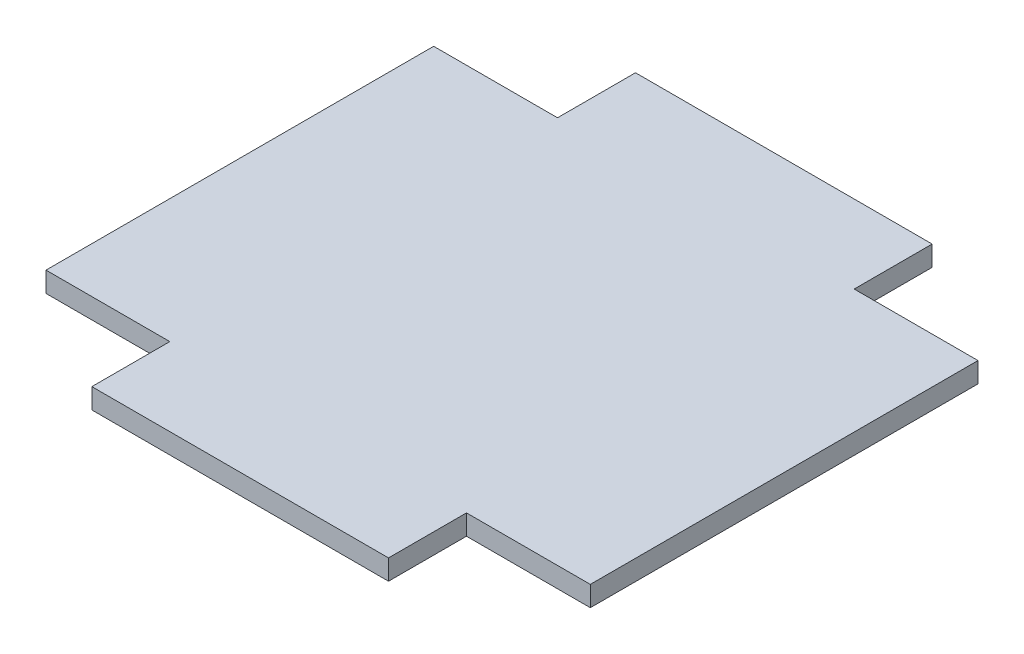
ISO-10303-21;
HEADER;
FILE_DESCRIPTION(('STEP AP214'),'2;1');
FILE_NAME('part.step','',(''),(''),'','','');
FILE_SCHEMA(('AUTOMOTIVE_DESIGN { 1 0 10303 214 1 1 1 1 }'));
ENDSEC;
DATA;
#1=APPLICATION_CONTEXT('core data for automotive mechanical design processes');
#2=APPLICATION_PROTOCOL_DEFINITION('international standard','automotive_design',2000,#1);
#3=PRODUCT_CONTEXT('',#1,'mechanical');
#4=PRODUCT('Part','Part','',(#3));
#5=PRODUCT_RELATED_PRODUCT_CATEGORY('part','',(#4));
#6=PRODUCT_DEFINITION_FORMATION('','',#4);
#7=PRODUCT_DEFINITION_CONTEXT('part definition',#1,'design');
#8=PRODUCT_DEFINITION('design','',#6,#7);
#9=PRODUCT_DEFINITION_SHAPE('','',#8);
#10=(LENGTH_UNIT() NAMED_UNIT(*) SI_UNIT(.MILLI.,.METRE.));
#11=(NAMED_UNIT(*) PLANE_ANGLE_UNIT() SI_UNIT($,.RADIAN.));
#12=(NAMED_UNIT(*) SI_UNIT($,.STERADIAN.) SOLID_ANGLE_UNIT());
#13=UNCERTAINTY_MEASURE_WITH_UNIT(LENGTH_MEASURE(1.E-05),#10,'distance_accuracy_value','');
#14=(GEOMETRIC_REPRESENTATION_CONTEXT(3) GLOBAL_UNCERTAINTY_ASSIGNED_CONTEXT((#13)) GLOBAL_UNIT_ASSIGNED_CONTEXT((#10,
#11,#12)) REPRESENTATION_CONTEXT('',''));
#15=CARTESIAN_POINT('',(0.,0.,0.));
#16=DIRECTION('',(0.,0.,1.));
#17=DIRECTION('',(1.,0.,0.));
#18=AXIS2_PLACEMENT_3D('',#15,#16,#17);
#19=CARTESIAN_POINT('',(7.40524174118847,3.,-22.9007241262733));
#20=DIRECTION('',(1.,0.,0.));
#21=DIRECTION('',(0.,0.,-1.));
#22=AXIS2_PLACEMENT_3D('',#19,#20,#21);
#23=PLANE('',#22);
#24=DIRECTION('',(0.,0.,1.));
#25=VECTOR('',#24,1.);
#26=CARTESIAN_POINT('',(7.40524174118847,0.,-22.9007241262733));
#27=LINE('',#26,#25);
#28=CARTESIAN_POINT('',(7.40524174118848,0.,-34.4657241262733));
#29=VERTEX_POINT('',#28);
#30=CARTESIAN_POINT('',(7.40524174118847,0.,-22.9007241262733));
#31=VERTEX_POINT('',#30);
#32=EDGE_CURVE('E153',#29,#31,#27,.T.);
#33=ORIENTED_EDGE('',*,*,#32,.T.);
#34=DIRECTION('',(0.,-1.,0.));
#35=VECTOR('',#34,1.);
#36=CARTESIAN_POINT('',(7.40524174118847,3.,-22.9007241262733));
#37=LINE('',#36,#35);
#38=CARTESIAN_POINT('',(7.40524174118847,3.,-22.9007241262733));
#39=VERTEX_POINT('',#38);
#40=EDGE_CURVE('E11',#39,#31,#37,.T.);
#41=ORIENTED_EDGE('',*,*,#40,.F.);
#42=DIRECTION('',(0.,0.,1.));
#43=VECTOR('',#42,1.);
#44=CARTESIAN_POINT('',(7.40524174118847,3.,-22.9007241262733));
#45=LINE('',#44,#43);
#46=CARTESIAN_POINT('',(7.40524174118848,3.,-34.4657241262733));
#47=VERTEX_POINT('',#46);
#48=EDGE_CURVE('E175',#47,#39,#45,.T.);
#49=ORIENTED_EDGE('',*,*,#48,.F.);
#50=DIRECTION('',(0.,-1.,0.));
#51=VECTOR('',#50,1.);
#52=CARTESIAN_POINT('',(7.40524174118848,3.,-34.4657241262733));
#53=LINE('',#52,#51);
#54=EDGE_CURVE('E149',#47,#29,#53,.T.);
#55=ORIENTED_EDGE('',*,*,#54,.T.);
#56=EDGE_LOOP('',(#33,#41,#49,#55));
#57=FACE_BOUND('',#56,.T.);
#58=ADVANCED_FACE('F33',(#57),#23,.F.);
#59=CARTESIAN_POINT('',(-10.9597582588115,3.,-22.9007241262733));
#60=DIRECTION('',(0.,0.,1.));
#61=DIRECTION('',(1.,0.,0.));
#62=AXIS2_PLACEMENT_3D('',#59,#60,#61);
#63=PLANE('',#62);
#64=DIRECTION('',(-1.,0.,0.));
#65=VECTOR('',#64,1.);
#66=CARTESIAN_POINT('',(-10.9597582588115,0.,-22.9007241262733));
#67=LINE('',#66,#65);
#68=CARTESIAN_POINT('',(-10.9597582588115,0.,-22.9007241262733));
#69=VERTEX_POINT('',#68);
#70=EDGE_CURVE('E156',#31,#69,#67,.T.);
#71=ORIENTED_EDGE('',*,*,#70,.T.);
#72=DIRECTION('',(0.,-1.,0.));
#73=VECTOR('',#72,1.);
#74=CARTESIAN_POINT('',(-10.9597582588115,3.,-22.9007241262733));
#75=LINE('',#74,#73);
#76=CARTESIAN_POINT('',(-10.9597582588115,3.,-22.9007241262733));
#77=VERTEX_POINT('',#76);
#78=EDGE_CURVE('E41',#77,#69,#75,.T.);
#79=ORIENTED_EDGE('',*,*,#78,.F.);
#80=DIRECTION('',(-1.,0.,0.));
#81=VECTOR('',#80,1.);
#82=CARTESIAN_POINT('',(-10.9597582588115,3.,-22.9007241262733));
#83=LINE('',#82,#81);
#84=EDGE_CURVE('E104',#39,#77,#83,.T.);
#85=ORIENTED_EDGE('',*,*,#84,.F.);
#86=ORIENTED_EDGE('',*,*,#40,.T.);
#87=EDGE_LOOP('',(#71,#79,#85,#86));
#88=FACE_BOUND('',#87,.T.);
#89=ADVANCED_FACE('F253',(#88),#63,.F.);
#90=CARTESIAN_POINT('',(-10.9597582588115,3.,34.5992758737267));
#91=DIRECTION('',(1.,0.,0.));
#92=DIRECTION('',(0.,0.,-1.));
#93=AXIS2_PLACEMENT_3D('',#90,#91,#92);
#94=PLANE('',#93);
#95=DIRECTION('',(0.,0.,1.));
#96=VECTOR('',#95,1.);
#97=CARTESIAN_POINT('',(-10.9597582588115,0.,34.5992758737267));
#98=LINE('',#97,#96);
#99=CARTESIAN_POINT('',(-10.9597582588115,0.,34.5992758737267));
#100=VERTEX_POINT('',#99);
#101=EDGE_CURVE('E158',#69,#100,#98,.T.);
#102=ORIENTED_EDGE('',*,*,#101,.T.);
#103=DIRECTION('',(0.,-1.,0.));
#104=VECTOR('',#103,1.);
#105=CARTESIAN_POINT('',(-10.9597582588115,3.,34.5992758737267));
#106=LINE('',#105,#104);
#107=CARTESIAN_POINT('',(-10.9597582588115,3.,34.5992758737267));
#108=VERTEX_POINT('',#107);
#109=EDGE_CURVE('E194',#108,#100,#106,.T.);
#110=ORIENTED_EDGE('',*,*,#109,.F.);
#111=DIRECTION('',(0.,0.,1.));
#112=VECTOR('',#111,1.);
#113=CARTESIAN_POINT('',(-10.9597582588115,3.,34.5992758737267));
#114=LINE('',#113,#112);
#115=EDGE_CURVE('E202',#77,#108,#114,.T.);
#116=ORIENTED_EDGE('',*,*,#115,.F.);
#117=ORIENTED_EDGE('',*,*,#78,.T.);
#118=EDGE_LOOP('',(#102,#110,#116,#117));
#119=FACE_BOUND('',#118,.T.);
#120=ADVANCED_FACE('F200',(#119),#94,.F.);
#121=CARTESIAN_POINT('',(7.40524174118849,3.,34.5992758737267));
#122=DIRECTION('',(0.,0.,-1.));
#123=DIRECTION('',(-1.,0.,0.));
#124=AXIS2_PLACEMENT_3D('',#121,#122,#123);
#125=PLANE('',#124);
#126=DIRECTION('',(1.,0.,0.));
#127=VECTOR('',#126,1.);
#128=CARTESIAN_POINT('',(7.40524174118849,0.,34.5992758737267));
#129=LINE('',#128,#127);
#130=CARTESIAN_POINT('',(7.40524174118849,0.,34.5992758737267));
#131=VERTEX_POINT('',#130);
#132=EDGE_CURVE('E160',#100,#131,#129,.T.);
#133=ORIENTED_EDGE('',*,*,#132,.T.);
#134=DIRECTION('',(0.,-1.,0.));
#135=VECTOR('',#134,1.);
#136=CARTESIAN_POINT('',(7.40524174118849,3.,34.5992758737267));
#137=LINE('',#136,#135);
#138=CARTESIAN_POINT('',(7.40524174118849,3.,34.5992758737267));
#139=VERTEX_POINT('',#138);
#140=EDGE_CURVE('E191',#139,#131,#137,.T.);
#141=ORIENTED_EDGE('',*,*,#140,.F.);
#142=DIRECTION('',(1.,0.,0.));
#143=VECTOR('',#142,1.);
#144=CARTESIAN_POINT('',(7.40524174118849,3.,34.5992758737267));
#145=LINE('',#144,#143);
#146=EDGE_CURVE('E220',#108,#139,#145,.T.);
#147=ORIENTED_EDGE('',*,*,#146,.F.);
#148=ORIENTED_EDGE('',*,*,#109,.T.);
#149=EDGE_LOOP('',(#133,#141,#147,#148));
#150=FACE_BOUND('',#149,.T.);
#151=ADVANCED_FACE('F211',(#150),#125,.F.);
#152=CARTESIAN_POINT('',(7.40524174118849,3.,34.5992758737267));
#153=DIRECTION('',(1.,0.,0.));
#154=DIRECTION('',(0.,0.,-1.));
#155=AXIS2_PLACEMENT_3D('',#152,#153,#154);
#156=PLANE('',#155);
#157=DIRECTION('',(0.,0.,1.));
#158=VECTOR('',#157,1.);
#159=CARTESIAN_POINT('',(7.40524174118849,0.,34.5992758737267));
#160=LINE('',#159,#158);
#161=CARTESIAN_POINT('',(7.40524174118849,0.,46.1642758737267));
#162=VERTEX_POINT('',#161);
#163=EDGE_CURVE('E162',#131,#162,#160,.T.);
#164=ORIENTED_EDGE('',*,*,#163,.T.);
#165=DIRECTION('',(0.,-1.,0.));
#166=VECTOR('',#165,1.);
#167=CARTESIAN_POINT('',(7.40524174118849,3.,46.1642758737267));
#168=LINE('',#167,#166);
#169=CARTESIAN_POINT('',(7.40524174118849,3.,46.1642758737267));
#170=VERTEX_POINT('',#169);
#171=EDGE_CURVE('E188',#170,#162,#168,.T.);
#172=ORIENTED_EDGE('',*,*,#171,.F.);
#173=DIRECTION('',(0.,0.,1.));
#174=VECTOR('',#173,1.);
#175=CARTESIAN_POINT('',(7.40524174118849,3.,34.5992758737267));
#176=LINE('',#175,#174);
#177=EDGE_CURVE('E217',#139,#170,#176,.T.);
#178=ORIENTED_EDGE('',*,*,#177,.F.);
#179=ORIENTED_EDGE('',*,*,#140,.T.);
#180=EDGE_LOOP('',(#164,#172,#178,#179));
#181=FACE_BOUND('',#180,.T.);
#182=ADVANCED_FACE('F215',(#181),#156,.F.);
#183=CARTESIAN_POINT('',(7.40524174118849,3.,46.1642758737267));
#184=DIRECTION('',(0.,0.,-1.));
#185=DIRECTION('',(-1.,0.,0.));
#186=AXIS2_PLACEMENT_3D('',#183,#184,#185);
#187=PLANE('',#186);
#188=DIRECTION('',(1.,0.,0.));
#189=VECTOR('',#188,1.);
#190=CARTESIAN_POINT('',(7.40524174118849,0.,46.1642758737267));
#191=LINE('',#190,#189);
#192=CARTESIAN_POINT('',(51.4052417411885,0.,46.1642758737267));
#193=VERTEX_POINT('',#192);
#194=EDGE_CURVE('E164',#162,#193,#191,.T.);
#195=ORIENTED_EDGE('',*,*,#194,.T.);
#196=DIRECTION('',(0.,-1.,0.));
#197=VECTOR('',#196,1.);
#198=CARTESIAN_POINT('',(51.4052417411885,3.,46.1642758737267));
#199=LINE('',#198,#197);
#200=CARTESIAN_POINT('',(51.4052417411885,3.,46.1642758737267));
#201=VERTEX_POINT('',#200);
#202=EDGE_CURVE('E185',#201,#193,#199,.T.);
#203=ORIENTED_EDGE('',*,*,#202,.F.);
#204=DIRECTION('',(1.,0.,0.));
#205=VECTOR('',#204,1.);
#206=CARTESIAN_POINT('',(7.40524174118849,3.,46.1642758737267));
#207=LINE('',#206,#205);
#208=EDGE_CURVE('E219',#170,#201,#207,.T.);
#209=ORIENTED_EDGE('',*,*,#208,.F.);
#210=ORIENTED_EDGE('',*,*,#171,.T.);
#211=EDGE_LOOP('',(#195,#203,#209,#210));
#212=FACE_BOUND('',#211,.T.);
#213=ADVANCED_FACE('F266',(#212),#187,.F.);
#214=CARTESIAN_POINT('',(51.4052417411885,3.,46.1642758737267));
#215=DIRECTION('',(-1.,0.,0.));
#216=DIRECTION('',(0.,0.,1.));
#217=AXIS2_PLACEMENT_3D('',#214,#215,#216);
#218=PLANE('',#217);
#219=DIRECTION('',(0.,0.,-1.));
#220=VECTOR('',#219,1.);
#221=CARTESIAN_POINT('',(51.4052417411885,0.,46.1642758737267));
#222=LINE('',#221,#220);
#223=CARTESIAN_POINT('',(51.4052417411885,0.,34.5992758737267));
#224=VERTEX_POINT('',#223);
#225=EDGE_CURVE('E166',#193,#224,#222,.T.);
#226=ORIENTED_EDGE('',*,*,#225,.T.);
#227=DIRECTION('',(0.,-1.,0.));
#228=VECTOR('',#227,1.);
#229=CARTESIAN_POINT('',(51.4052417411885,3.,34.5992758737267));
#230=LINE('',#229,#228);
#231=CARTESIAN_POINT('',(51.4052417411885,3.,34.5992758737267));
#232=VERTEX_POINT('',#231);
#233=EDGE_CURVE('E182',#232,#224,#230,.T.);
#234=ORIENTED_EDGE('',*,*,#233,.F.);
#235=DIRECTION('',(0.,0.,-1.));
#236=VECTOR('',#235,1.);
#237=CARTESIAN_POINT('',(51.4052417411885,3.,46.1642758737267));
#238=LINE('',#237,#236);
#239=EDGE_CURVE('E222',#201,#232,#238,.T.);
#240=ORIENTED_EDGE('',*,*,#239,.F.);
#241=ORIENTED_EDGE('',*,*,#202,.T.);
#242=EDGE_LOOP('',(#226,#234,#240,#241));
#243=FACE_BOUND('',#242,.T.);
#244=ADVANCED_FACE('F269',(#243),#218,.F.);
#245=CARTESIAN_POINT('',(69.7702417411885,3.,34.5992758737267));
#246=DIRECTION('',(0.,0.,-1.));
#247=DIRECTION('',(-1.,0.,0.));
#248=AXIS2_PLACEMENT_3D('',#245,#246,#247);
#249=PLANE('',#248);
#250=DIRECTION('',(1.,0.,0.));
#251=VECTOR('',#250,1.);
#252=CARTESIAN_POINT('',(69.7702417411885,0.,34.5992758737267));
#253=LINE('',#252,#251);
#254=CARTESIAN_POINT('',(69.7702417411885,0.,34.5992758737267));
#255=VERTEX_POINT('',#254);
#256=EDGE_CURVE('E168',#224,#255,#253,.T.);
#257=ORIENTED_EDGE('',*,*,#256,.T.);
#258=DIRECTION('',(0.,-1.,0.));
#259=VECTOR('',#258,1.);
#260=CARTESIAN_POINT('',(69.7702417411885,3.,34.5992758737267));
#261=LINE('',#260,#259);
#262=CARTESIAN_POINT('',(69.7702417411885,3.,34.5992758737267));
#263=VERTEX_POINT('',#262);
#264=EDGE_CURVE('E179',#263,#255,#261,.T.);
#265=ORIENTED_EDGE('',*,*,#264,.F.);
#266=DIRECTION('',(1.,0.,0.));
#267=VECTOR('',#266,1.);
#268=CARTESIAN_POINT('',(69.7702417411885,3.,34.5992758737267));
#269=LINE('',#268,#267);
#270=EDGE_CURVE('E228',#232,#263,#269,.T.);
#271=ORIENTED_EDGE('',*,*,#270,.F.);
#272=ORIENTED_EDGE('',*,*,#233,.T.);
#273=EDGE_LOOP('',(#257,#265,#271,#272));
#274=FACE_BOUND('',#273,.T.);
#275=ADVANCED_FACE('F234',(#274),#249,.F.);
#276=CARTESIAN_POINT('',(69.7702417411885,3.,-22.9007241262733));
#277=DIRECTION('',(-1.,0.,0.));
#278=DIRECTION('',(0.,0.,1.));
#279=AXIS2_PLACEMENT_3D('',#276,#277,#278);
#280=PLANE('',#279);
#281=DIRECTION('',(0.,0.,-1.));
#282=VECTOR('',#281,1.);
#283=CARTESIAN_POINT('',(69.7702417411885,0.,-22.9007241262733));
#284=LINE('',#283,#282);
#285=CARTESIAN_POINT('',(69.7702417411885,0.,-22.9007241262733));
#286=VERTEX_POINT('',#285);
#287=EDGE_CURVE('E170',#255,#286,#284,.T.);
#288=ORIENTED_EDGE('',*,*,#287,.T.);
#289=DIRECTION('',(0.,-1.,0.));
#290=VECTOR('',#289,1.);
#291=CARTESIAN_POINT('',(69.7702417411885,3.,-22.9007241262733));
#292=LINE('',#291,#290);
#293=CARTESIAN_POINT('',(69.7702417411885,3.,-22.9007241262733));
#294=VERTEX_POINT('',#293);
#295=EDGE_CURVE('E144',#294,#286,#292,.T.);
#296=ORIENTED_EDGE('',*,*,#295,.F.);
#297=DIRECTION('',(0.,0.,-1.));
#298=VECTOR('',#297,1.);
#299=CARTESIAN_POINT('',(69.7702417411885,3.,-22.9007241262733));
#300=LINE('',#299,#298);
#301=EDGE_CURVE('E135',#263,#294,#300,.T.);
#302=ORIENTED_EDGE('',*,*,#301,.F.);
#303=ORIENTED_EDGE('',*,*,#264,.T.);
#304=EDGE_LOOP('',(#288,#296,#302,#303));
#305=FACE_BOUND('',#304,.T.);
#306=ADVANCED_FACE('F238',(#305),#280,.F.);
#307=CARTESIAN_POINT('',(51.4052417411885,3.,-22.9007241262733));
#308=DIRECTION('',(0.,0.,1.));
#309=DIRECTION('',(1.,0.,0.));
#310=AXIS2_PLACEMENT_3D('',#307,#308,#309);
#311=PLANE('',#310);
#312=DIRECTION('',(-1.,0.,0.));
#313=VECTOR('',#312,1.);
#314=CARTESIAN_POINT('',(51.4052417411885,0.,-22.9007241262733));
#315=LINE('',#314,#313);
#316=CARTESIAN_POINT('',(51.4052417411885,0.,-22.9007241262733));
#317=VERTEX_POINT('',#316);
#318=EDGE_CURVE('E143',#286,#317,#315,.T.);
#319=ORIENTED_EDGE('',*,*,#318,.T.);
#320=DIRECTION('',(0.,-1.,0.));
#321=VECTOR('',#320,1.);
#322=CARTESIAN_POINT('',(51.4052417411885,3.,-22.9007241262733));
#323=LINE('',#322,#321);
#324=CARTESIAN_POINT('',(51.4052417411885,3.,-22.9007241262733));
#325=VERTEX_POINT('',#324);
#326=EDGE_CURVE('E140',#325,#317,#323,.T.);
#327=ORIENTED_EDGE('',*,*,#326,.F.);
#328=DIRECTION('',(-1.,0.,0.));
#329=VECTOR('',#328,1.);
#330=CARTESIAN_POINT('',(51.4052417411885,3.,-22.9007241262733));
#331=LINE('',#330,#329);
#332=EDGE_CURVE('E129',#294,#325,#331,.T.);
#333=ORIENTED_EDGE('',*,*,#332,.F.);
#334=ORIENTED_EDGE('',*,*,#295,.T.);
#335=EDGE_LOOP('',(#319,#327,#333,#334));
#336=FACE_BOUND('',#335,.T.);
#337=ADVANCED_FACE('F141',(#336),#311,.F.);
#338=CARTESIAN_POINT('',(51.4052417411885,3.,-34.4657241262733));
#339=DIRECTION('',(-1.,0.,0.));
#340=DIRECTION('',(0.,0.,1.));
#341=AXIS2_PLACEMENT_3D('',#338,#339,#340);
#342=PLANE('',#341);
#343=DIRECTION('',(0.,0.,-1.));
#344=VECTOR('',#343,1.);
#345=CARTESIAN_POINT('',(51.4052417411885,0.,-34.4657241262733));
#346=LINE('',#345,#344);
#347=CARTESIAN_POINT('',(51.4052417411885,0.,-34.4657241262733));
#348=VERTEX_POINT('',#347);
#349=EDGE_CURVE('E90',#317,#348,#346,.T.);
#350=ORIENTED_EDGE('',*,*,#349,.T.);
#351=DIRECTION('',(0.,-1.,0.));
#352=VECTOR('',#351,1.);
#353=CARTESIAN_POINT('',(51.4052417411885,3.,-34.4657241262733));
#354=LINE('',#353,#352);
#355=CARTESIAN_POINT('',(51.4052417411885,3.,-34.4657241262733));
#356=VERTEX_POINT('',#355);
#357=EDGE_CURVE('E145',#356,#348,#354,.T.);
#358=ORIENTED_EDGE('',*,*,#357,.F.);
#359=DIRECTION('',(0.,0.,-1.));
#360=VECTOR('',#359,1.);
#361=CARTESIAN_POINT('',(51.4052417411885,3.,-34.4657241262733));
#362=LINE('',#361,#360);
#363=EDGE_CURVE('E133',#325,#356,#362,.T.);
#364=ORIENTED_EDGE('',*,*,#363,.F.);
#365=ORIENTED_EDGE('',*,*,#326,.T.);
#366=EDGE_LOOP('',(#350,#358,#364,#365));
#367=FACE_BOUND('',#366,.T.);
#368=ADVANCED_FACE('F147',(#367),#342,.F.);
#369=CARTESIAN_POINT('',(51.4052417411885,3.,-34.4657241262733));
#370=DIRECTION('',(0.,0.,1.));
#371=DIRECTION('',(1.,0.,0.));
#372=AXIS2_PLACEMENT_3D('',#369,#370,#371);
#373=PLANE('',#372);
#374=DIRECTION('',(-1.,0.,0.));
#375=VECTOR('',#374,1.);
#376=CARTESIAN_POINT('',(51.4052417411885,0.,-34.4657241262733));
#377=LINE('',#376,#375);
#378=EDGE_CURVE('E96',#348,#29,#377,.T.);
#379=ORIENTED_EDGE('',*,*,#378,.T.);
#380=ORIENTED_EDGE('',*,*,#54,.F.);
#381=DIRECTION('',(-1.,0.,0.));
#382=VECTOR('',#381,1.);
#383=CARTESIAN_POINT('',(51.4052417411885,3.,-34.4657241262733));
#384=LINE('',#383,#382);
#385=EDGE_CURVE('E49',#356,#47,#384,.T.);
#386=ORIENTED_EDGE('',*,*,#385,.F.);
#387=ORIENTED_EDGE('',*,*,#357,.T.);
#388=EDGE_LOOP('',(#379,#380,#386,#387));
#389=FACE_BOUND('',#388,.T.);
#390=ADVANCED_FACE('F242',(#389),#373,.F.);
#391=CARTESIAN_POINT('',(0.,3.,0.));
#392=DIRECTION('',(0.,1.,0.));
#393=DIRECTION('',(0.,0.,1.));
#394=AXIS2_PLACEMENT_3D('',#391,#392,#393);
#395=PLANE('',#394);
#396=ORIENTED_EDGE('',*,*,#48,.T.);
#397=ORIENTED_EDGE('',*,*,#84,.T.);
#398=ORIENTED_EDGE('',*,*,#115,.T.);
#399=ORIENTED_EDGE('',*,*,#146,.T.);
#400=ORIENTED_EDGE('',*,*,#177,.T.);
#401=ORIENTED_EDGE('',*,*,#208,.T.);
#402=ORIENTED_EDGE('',*,*,#239,.T.);
#403=ORIENTED_EDGE('',*,*,#270,.T.);
#404=ORIENTED_EDGE('',*,*,#301,.T.);
#405=ORIENTED_EDGE('',*,*,#332,.T.);
#406=ORIENTED_EDGE('',*,*,#363,.T.);
#407=ORIENTED_EDGE('',*,*,#385,.T.);
#408=EDGE_LOOP('',(#396,#397,#398,#399,#400,#401,#402,#403,#404,#405,#406,#407));
#409=FACE_BOUND('',#408,.T.);
#410=ADVANCED_FACE('F131',(#409),#395,.T.);
#411=CARTESIAN_POINT('',(0.,0.,0.));
#412=DIRECTION('',(0.,1.,0.));
#413=DIRECTION('',(0.,0.,1.));
#414=AXIS2_PLACEMENT_3D('',#411,#412,#413);
#415=PLANE('',#414);
#416=ORIENTED_EDGE('',*,*,#32,.F.);
#417=ORIENTED_EDGE('',*,*,#378,.F.);
#418=ORIENTED_EDGE('',*,*,#349,.F.);
#419=ORIENTED_EDGE('',*,*,#318,.F.);
#420=ORIENTED_EDGE('',*,*,#287,.F.);
#421=ORIENTED_EDGE('',*,*,#256,.F.);
#422=ORIENTED_EDGE('',*,*,#225,.F.);
#423=ORIENTED_EDGE('',*,*,#194,.F.);
#424=ORIENTED_EDGE('',*,*,#163,.F.);
#425=ORIENTED_EDGE('',*,*,#132,.F.);
#426=ORIENTED_EDGE('',*,*,#101,.F.);
#427=ORIENTED_EDGE('',*,*,#70,.F.);
#428=EDGE_LOOP('',(#416,#417,#418,#419,#420,#421,#422,#423,#424,#425,#426,#427));
#429=FACE_BOUND('',#428,.T.);
#430=ADVANCED_FACE('F206',(#429),#415,.F.);
#431=CLOSED_SHELL('',(#58,#89,#120,#151,#182,#213,#244,#275,#306,#337,#368,#390,#410,#430));
#432=MANIFOLD_SOLID_BREP('B2',#431);
#433=ADVANCED_BREP_SHAPE_REPRESENTATION('',(#18,#432),#14);
#434=SHAPE_DEFINITION_REPRESENTATION(#9,#433);
ENDSEC;
END-ISO-10303-21;
